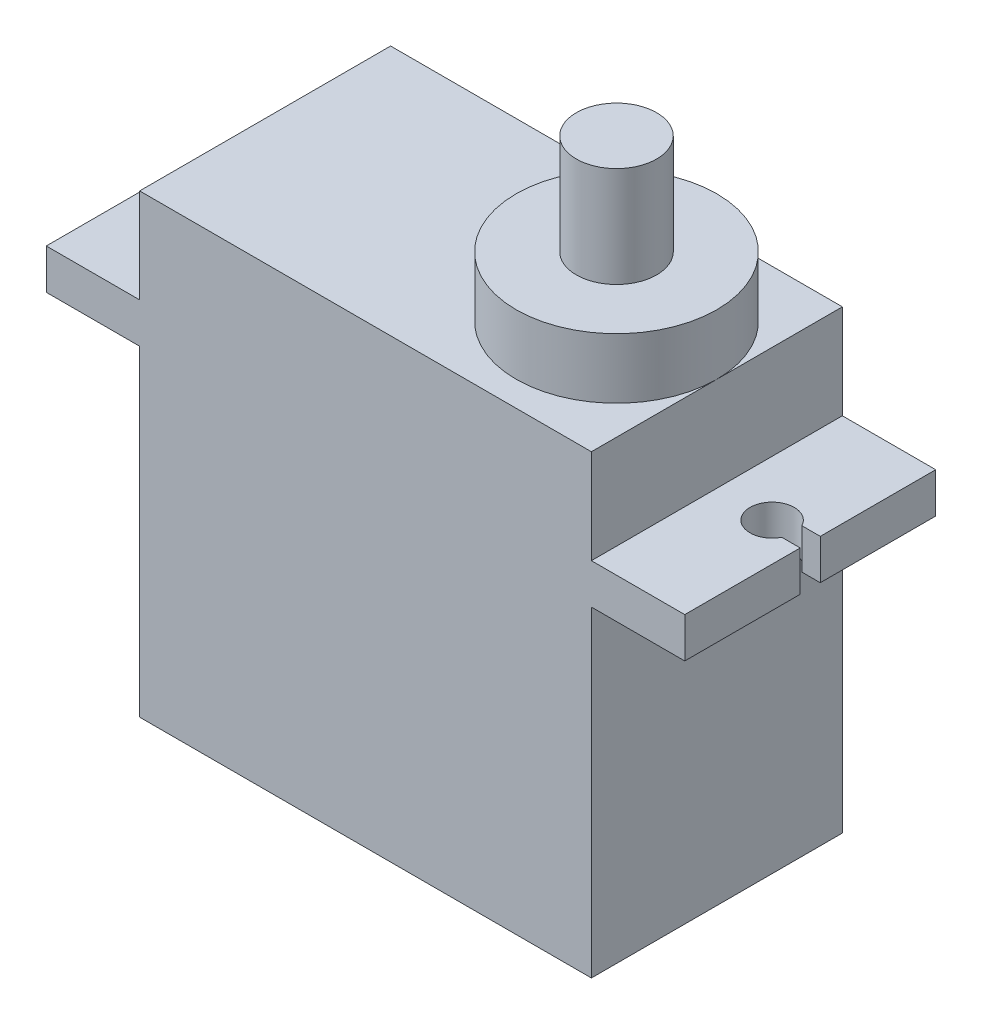
ISO-10303-21;
HEADER;
FILE_DESCRIPTION(('STEP AP214'),'2;1');
FILE_NAME('part.step','',(''),(''),'','','');
FILE_SCHEMA(('AUTOMOTIVE_DESIGN { 1 0 10303 214 1 1 1 1 }'));
ENDSEC;
DATA;
#1=APPLICATION_CONTEXT('core data for automotive mechanical design processes');
#2=APPLICATION_PROTOCOL_DEFINITION('international standard','automotive_design',2000,#1);
#3=PRODUCT_CONTEXT('',#1,'mechanical');
#4=PRODUCT('Part','Part','',(#3));
#5=PRODUCT_RELATED_PRODUCT_CATEGORY('part','',(#4));
#6=PRODUCT_DEFINITION_FORMATION('','',#4);
#7=PRODUCT_DEFINITION_CONTEXT('part definition',#1,'design');
#8=PRODUCT_DEFINITION('design','',#6,#7);
#9=PRODUCT_DEFINITION_SHAPE('','',#8);
#10=(LENGTH_UNIT() NAMED_UNIT(*) SI_UNIT(.MILLI.,.METRE.));
#11=(NAMED_UNIT(*) PLANE_ANGLE_UNIT() SI_UNIT($,.RADIAN.));
#12=(NAMED_UNIT(*) SI_UNIT($,.STERADIAN.) SOLID_ANGLE_UNIT());
#13=UNCERTAINTY_MEASURE_WITH_UNIT(LENGTH_MEASURE(1.E-05),#10,'distance_accuracy_value','');
#14=(GEOMETRIC_REPRESENTATION_CONTEXT(3) GLOBAL_UNCERTAINTY_ASSIGNED_CONTEXT((#13)) GLOBAL_UNIT_ASSIGNED_CONTEXT((#10,
#11,#12)) REPRESENTATION_CONTEXT('',''));
#15=CARTESIAN_POINT('',(0.,0.,0.));
#16=DIRECTION('',(0.,0.,1.));
#17=DIRECTION('',(1.,0.,0.));
#18=AXIS2_PLACEMENT_3D('',#15,#16,#17);
#19=CARTESIAN_POINT('',(-14.,18.,0.));
#20=DIRECTION('',(0.,1.,0.));
#21=DIRECTION('',(0.,0.,1.));
#22=AXIS2_PLACEMENT_3D('',#19,#20,#21);
#23=PLANE('',#22);
#24=DIRECTION('',(0.,0.,-1.));
#25=VECTOR('',#24,1.);
#26=CARTESIAN_POINT('',(11.25,18.,6.25));
#27=LINE('',#26,#25);
#28=CARTESIAN_POINT('',(11.25,18.,6.25));
#29=VERTEX_POINT('',#28);
#30=CARTESIAN_POINT('',(11.25,18.,-6.25));
#31=VERTEX_POINT('',#30);
#32=EDGE_CURVE('E52',#29,#31,#27,.T.);
#33=ORIENTED_EDGE('',*,*,#32,.F.);
#34=DIRECTION('',(1.,0.,0.));
#35=VECTOR('',#34,1.);
#36=CARTESIAN_POINT('',(-15.9,18.,6.25));
#37=LINE('',#36,#35);
#38=CARTESIAN_POINT('',(15.9,18.,6.25));
#39=VERTEX_POINT('',#38);
#40=EDGE_CURVE('E238',#29,#39,#37,.T.);
#41=ORIENTED_EDGE('',*,*,#40,.T.);
#42=DIRECTION('',(0.,0.,-1.));
#43=VECTOR('',#42,1.);
#44=CARTESIAN_POINT('',(15.9,18.,0.500000000000001));
#45=LINE('',#44,#43);
#46=CARTESIAN_POINT('',(15.9,18.,0.500000000000001));
#47=VERTEX_POINT('',#46);
#48=EDGE_CURVE('E213',#39,#47,#45,.T.);
#49=ORIENTED_EDGE('',*,*,#48,.T.);
#50=DIRECTION('',(-1.,0.,0.));
#51=VECTOR('',#50,1.);
#52=CARTESIAN_POINT('',(15.9,18.,0.500000000000001));
#53=LINE('',#52,#51);
#54=CARTESIAN_POINT('',(14.9797958971133,18.,0.5));
#55=VERTEX_POINT('',#54);
#56=EDGE_CURVE('E216',#47,#55,#53,.T.);
#57=ORIENTED_EDGE('',*,*,#56,.T.);
#58=CARTESIAN_POINT('',(14.,18.,0.));
#59=DIRECTION('',(0.,-1.,0.));
#60=DIRECTION('',(0.,0.,-1.));
#61=AXIS2_PLACEMENT_3D('',#58,#59,#60);
#62=CIRCLE('',#61,1.1);
#63=CARTESIAN_POINT('',(14.9797958971133,18.,-0.5));
#64=VERTEX_POINT('',#63);
#65=EDGE_CURVE('E219',#55,#64,#62,.T.);
#66=ORIENTED_EDGE('',*,*,#65,.T.);
#67=DIRECTION('',(1.,0.,0.));
#68=VECTOR('',#67,1.);
#69=CARTESIAN_POINT('',(15.9,18.,-0.5));
#70=LINE('',#69,#68);
#71=CARTESIAN_POINT('',(15.9,18.,-0.5));
#72=VERTEX_POINT('',#71);
#73=EDGE_CURVE('E221',#64,#72,#70,.T.);
#74=ORIENTED_EDGE('',*,*,#73,.T.);
#75=DIRECTION('',(0.,0.,-1.));
#76=VECTOR('',#75,1.);
#77=CARTESIAN_POINT('',(15.9,18.,-6.25));
#78=LINE('',#77,#76);
#79=CARTESIAN_POINT('',(15.9,18.,-6.25));
#80=VERTEX_POINT('',#79);
#81=EDGE_CURVE('E223',#72,#80,#78,.T.);
#82=ORIENTED_EDGE('',*,*,#81,.T.);
#83=DIRECTION('',(-1.,0.,0.));
#84=VECTOR('',#83,1.);
#85=CARTESIAN_POINT('',(-15.9,18.,-6.25));
#86=LINE('',#85,#84);
#87=EDGE_CURVE('E226',#80,#31,#86,.T.);
#88=ORIENTED_EDGE('',*,*,#87,.T.);
#89=EDGE_LOOP('',(#33,#41,#49,#57,#66,#74,#82,#88));
#90=FACE_BOUND('',#89,.T.);
#91=ADVANCED_FACE('F36',(#90),#23,.T.);
#92=CARTESIAN_POINT('',(11.25,16.,-6.25));
#93=DIRECTION('',(-1.,0.,0.));
#94=DIRECTION('',(0.,0.,1.));
#95=AXIS2_PLACEMENT_3D('',#92,#93,#94);
#96=PLANE('',#95);
#97=DIRECTION('',(0.,0.,-1.));
#98=VECTOR('',#97,1.);
#99=CARTESIAN_POINT('',(11.25,0.,-6.25));
#100=LINE('',#99,#98);
#101=CARTESIAN_POINT('',(11.25,0.,6.25));
#102=VERTEX_POINT('',#101);
#103=CARTESIAN_POINT('',(11.25,0.,-6.25));
#104=VERTEX_POINT('',#103);
#105=EDGE_CURVE('E304',#102,#104,#100,.T.);
#106=ORIENTED_EDGE('',*,*,#105,.T.);
#107=DIRECTION('',(0.,-1.,0.));
#108=VECTOR('',#107,1.);
#109=CARTESIAN_POINT('',(11.25,16.,-6.25));
#110=LINE('',#109,#108);
#111=CARTESIAN_POINT('',(11.25,16.,-6.25));
#112=VERTEX_POINT('',#111);
#113=EDGE_CURVE('E40',#112,#104,#110,.T.);
#114=ORIENTED_EDGE('',*,*,#113,.F.);
#115=DIRECTION('',(0.,0.,-1.));
#116=VECTOR('',#115,1.);
#117=CARTESIAN_POINT('',(11.25,16.,-6.25));
#118=LINE('',#117,#116);
#119=CARTESIAN_POINT('',(11.25,16.,6.25));
#120=VERTEX_POINT('',#119);
#121=EDGE_CURVE('E305',#120,#112,#118,.T.);
#122=ORIENTED_EDGE('',*,*,#121,.F.);
#123=DIRECTION('',(0.,-1.,0.));
#124=VECTOR('',#123,1.);
#125=CARTESIAN_POINT('',(11.25,16.,6.25));
#126=LINE('',#125,#124);
#127=EDGE_CURVE('E312',#120,#102,#126,.T.);
#128=ORIENTED_EDGE('',*,*,#127,.T.);
#129=EDGE_LOOP('',(#106,#114,#122,#128));
#130=FACE_BOUND('',#129,.T.);
#131=ADVANCED_FACE('F38',(#130),#96,.F.);
#132=CARTESIAN_POINT('',(-11.25,16.,-6.25));
#133=DIRECTION('',(0.,0.,1.));
#134=DIRECTION('',(1.,0.,0.));
#135=AXIS2_PLACEMENT_3D('',#132,#133,#134);
#136=PLANE('',#135);
#137=DIRECTION('',(-1.,0.,0.));
#138=VECTOR('',#137,1.);
#139=CARTESIAN_POINT('',(-11.25,0.,-6.25));
#140=LINE('',#139,#138);
#141=CARTESIAN_POINT('',(-11.25,0.,-6.25));
#142=VERTEX_POINT('',#141);
#143=EDGE_CURVE('E315',#104,#142,#140,.T.);
#144=ORIENTED_EDGE('',*,*,#143,.T.);
#145=DIRECTION('',(0.,-1.,0.));
#146=VECTOR('',#145,1.);
#147=CARTESIAN_POINT('',(-11.25,16.,-6.25));
#148=LINE('',#147,#146);
#149=CARTESIAN_POINT('',(-11.25,16.,-6.25));
#150=VERTEX_POINT('',#149);
#151=EDGE_CURVE('E324',#150,#142,#148,.T.);
#152=ORIENTED_EDGE('',*,*,#151,.F.);
#153=DIRECTION('',(-1.,0.,0.));
#154=VECTOR('',#153,1.);
#155=CARTESIAN_POINT('',(-15.9,16.,-6.25));
#156=LINE('',#155,#154);
#157=CARTESIAN_POINT('',(-15.9,16.,-6.25));
#158=VERTEX_POINT('',#157);
#159=EDGE_CURVE('E252',#150,#158,#156,.T.);
#160=ORIENTED_EDGE('',*,*,#159,.T.);
#161=DIRECTION('',(0.,-1.,0.));
#162=VECTOR('',#161,1.);
#163=CARTESIAN_POINT('',(-15.9,18.,-6.25));
#164=LINE('',#163,#162);
#165=CARTESIAN_POINT('',(-15.9,18.,-6.25));
#166=VERTEX_POINT('',#165);
#167=EDGE_CURVE('E286',#166,#158,#164,.T.);
#168=ORIENTED_EDGE('',*,*,#167,.F.);
#169=CARTESIAN_POINT('',(-11.25,18.,-6.25));
#170=VERTEX_POINT('',#169);
#171=EDGE_CURVE('E225',#170,#166,#86,.T.);
#172=ORIENTED_EDGE('',*,*,#171,.F.);
#173=DIRECTION('',(0.,-1.,0.));
#174=VECTOR('',#173,1.);
#175=CARTESIAN_POINT('',(-11.25,22.7,-6.25));
#176=LINE('',#175,#174);
#177=CARTESIAN_POINT('',(-11.25,22.7,-6.25));
#178=VERTEX_POINT('',#177);
#179=EDGE_CURVE('E209',#178,#170,#176,.T.);
#180=ORIENTED_EDGE('',*,*,#179,.F.);
#181=DIRECTION('',(-1.,0.,0.));
#182=VECTOR('',#181,1.);
#183=CARTESIAN_POINT('',(11.25,22.7,-6.25));
#184=LINE('',#183,#182);
#185=CARTESIAN_POINT('',(11.25,22.7,-6.25));
#186=VERTEX_POINT('',#185);
#187=EDGE_CURVE('E202',#186,#178,#184,.T.);
#188=ORIENTED_EDGE('',*,*,#187,.F.);
#189=DIRECTION('',(0.,-1.,0.));
#190=VECTOR('',#189,1.);
#191=CARTESIAN_POINT('',(11.25,22.7,-6.25));
#192=LINE('',#191,#190);
#193=EDGE_CURVE('E187',#186,#31,#192,.T.);
#194=ORIENTED_EDGE('',*,*,#193,.T.);
#195=ORIENTED_EDGE('',*,*,#87,.F.);
#196=DIRECTION('',(0.,-1.,0.));
#197=VECTOR('',#196,1.);
#198=CARTESIAN_POINT('',(15.9,18.,-6.25));
#199=LINE('',#198,#197);
#200=CARTESIAN_POINT('',(15.9,16.,-6.25));
#201=VERTEX_POINT('',#200);
#202=EDGE_CURVE('E289',#80,#201,#199,.T.);
#203=ORIENTED_EDGE('',*,*,#202,.T.);
#204=EDGE_CURVE('E253',#201,#112,#156,.T.);
#205=ORIENTED_EDGE('',*,*,#204,.T.);
#206=ORIENTED_EDGE('',*,*,#113,.T.);
#207=EDGE_LOOP('',(#144,#152,#160,#168,#172,#180,#188,#194,#195,#203,#205,#206));
#208=FACE_BOUND('',#207,.T.);
#209=ADVANCED_FACE('F331',(#208),#136,.F.);
#210=CARTESIAN_POINT('',(-11.25,16.,-6.25));
#211=DIRECTION('',(1.,0.,0.));
#212=DIRECTION('',(0.,0.,-1.));
#213=AXIS2_PLACEMENT_3D('',#210,#211,#212);
#214=PLANE('',#213);
#215=DIRECTION('',(0.,0.,1.));
#216=VECTOR('',#215,1.);
#217=CARTESIAN_POINT('',(-11.25,0.,-6.25));
#218=LINE('',#217,#216);
#219=CARTESIAN_POINT('',(-11.25,0.,6.25));
#220=VERTEX_POINT('',#219);
#221=EDGE_CURVE('E317',#142,#220,#218,.T.);
#222=ORIENTED_EDGE('',*,*,#221,.T.);
#223=DIRECTION('',(0.,-1.,0.));
#224=VECTOR('',#223,1.);
#225=CARTESIAN_POINT('',(-11.25,16.,6.25));
#226=LINE('',#225,#224);
#227=CARTESIAN_POINT('',(-11.25,16.,6.25));
#228=VERTEX_POINT('',#227);
#229=EDGE_CURVE('E322',#228,#220,#226,.T.);
#230=ORIENTED_EDGE('',*,*,#229,.F.);
#231=DIRECTION('',(0.,0.,1.));
#232=VECTOR('',#231,1.);
#233=CARTESIAN_POINT('',(-11.25,16.,-6.25));
#234=LINE('',#233,#232);
#235=EDGE_CURVE('E308',#150,#228,#234,.T.);
#236=ORIENTED_EDGE('',*,*,#235,.F.);
#237=ORIENTED_EDGE('',*,*,#151,.T.);
#238=EDGE_LOOP('',(#222,#230,#236,#237));
#239=FACE_BOUND('',#238,.T.);
#240=ADVANCED_FACE('F339',(#239),#214,.F.);
#241=CARTESIAN_POINT('',(-11.25,16.,6.25));
#242=DIRECTION('',(0.,0.,-1.));
#243=DIRECTION('',(-1.,0.,0.));
#244=AXIS2_PLACEMENT_3D('',#241,#242,#243);
#245=PLANE('',#244);
#246=DIRECTION('',(1.,0.,0.));
#247=VECTOR('',#246,1.);
#248=CARTESIAN_POINT('',(-11.25,0.,6.25));
#249=LINE('',#248,#247);
#250=EDGE_CURVE('E309',#220,#102,#249,.T.);
#251=ORIENTED_EDGE('',*,*,#250,.T.);
#252=ORIENTED_EDGE('',*,*,#127,.F.);
#253=DIRECTION('',(1.,0.,0.));
#254=VECTOR('',#253,1.);
#255=CARTESIAN_POINT('',(-15.9,16.,6.25));
#256=LINE('',#255,#254);
#257=CARTESIAN_POINT('',(15.9,16.,6.25));
#258=VERTEX_POINT('',#257);
#259=EDGE_CURVE('E266',#120,#258,#256,.T.);
#260=ORIENTED_EDGE('',*,*,#259,.T.);
#261=DIRECTION('',(0.,-1.,0.));
#262=VECTOR('',#261,1.);
#263=CARTESIAN_POINT('',(15.9,18.,6.25));
#264=LINE('',#263,#262);
#265=EDGE_CURVE('E241',#39,#258,#264,.T.);
#266=ORIENTED_EDGE('',*,*,#265,.F.);
#267=ORIENTED_EDGE('',*,*,#40,.F.);
#268=DIRECTION('',(0.,-1.,0.));
#269=VECTOR('',#268,1.);
#270=CARTESIAN_POINT('',(11.25,22.7,6.25));
#271=LINE('',#270,#269);
#272=CARTESIAN_POINT('',(11.25,22.7,6.25));
#273=VERTEX_POINT('',#272);
#274=EDGE_CURVE('E204',#273,#29,#271,.T.);
#275=ORIENTED_EDGE('',*,*,#274,.F.);
#276=DIRECTION('',(1.,0.,0.));
#277=VECTOR('',#276,1.);
#278=CARTESIAN_POINT('',(-11.25,22.7,6.25));
#279=LINE('',#278,#277);
#280=CARTESIAN_POINT('',(-11.25,22.7,6.25));
#281=VERTEX_POINT('',#280);
#282=EDGE_CURVE('E183',#281,#273,#279,.T.);
#283=ORIENTED_EDGE('',*,*,#282,.F.);
#284=DIRECTION('',(0.,-1.,0.));
#285=VECTOR('',#284,1.);
#286=CARTESIAN_POINT('',(-11.25,22.7,6.25));
#287=LINE('',#286,#285);
#288=CARTESIAN_POINT('',(-11.25,18.,6.25));
#289=VERTEX_POINT('',#288);
#290=EDGE_CURVE('E206',#281,#289,#287,.T.);
#291=ORIENTED_EDGE('',*,*,#290,.T.);
#292=CARTESIAN_POINT('',(-15.9,18.,6.25));
#293=VERTEX_POINT('',#292);
#294=EDGE_CURVE('E239',#293,#289,#37,.T.);
#295=ORIENTED_EDGE('',*,*,#294,.F.);
#296=DIRECTION('',(0.,-1.,0.));
#297=VECTOR('',#296,1.);
#298=CARTESIAN_POINT('',(-15.9,18.,6.25));
#299=LINE('',#298,#297);
#300=CARTESIAN_POINT('',(-15.9,16.,6.25));
#301=VERTEX_POINT('',#300);
#302=EDGE_CURVE('E271',#293,#301,#299,.T.);
#303=ORIENTED_EDGE('',*,*,#302,.T.);
#304=EDGE_CURVE('E217',#301,#228,#256,.T.);
#305=ORIENTED_EDGE('',*,*,#304,.T.);
#306=ORIENTED_EDGE('',*,*,#229,.T.);
#307=EDGE_LOOP('',(#251,#252,#260,#266,#267,#275,#283,#291,#295,#303,#305,#306));
#308=FACE_BOUND('',#307,.T.);
#309=ADVANCED_FACE('F341',(#308),#245,.F.);
#310=CARTESIAN_POINT('',(0.,0.,0.));
#311=DIRECTION('',(0.,1.,0.));
#312=DIRECTION('',(0.,0.,1.));
#313=AXIS2_PLACEMENT_3D('',#310,#311,#312);
#314=PLANE('',#313);
#315=ORIENTED_EDGE('',*,*,#105,.F.);
#316=ORIENTED_EDGE('',*,*,#250,.F.);
#317=ORIENTED_EDGE('',*,*,#221,.F.);
#318=ORIENTED_EDGE('',*,*,#143,.F.);
#319=EDGE_LOOP('',(#315,#316,#317,#318));
#320=FACE_BOUND('',#319,.T.);
#321=ADVANCED_FACE('F338',(#320),#314,.F.);
#322=CARTESIAN_POINT('',(-14.,16.,0.));
#323=DIRECTION('',(0.,1.,0.));
#324=DIRECTION('',(0.,0.,1.));
#325=AXIS2_PLACEMENT_3D('',#322,#323,#324);
#326=PLANE('',#325);
#327=ORIENTED_EDGE('',*,*,#259,.F.);
#328=ORIENTED_EDGE('',*,*,#121,.T.);
#329=ORIENTED_EDGE('',*,*,#204,.F.);
#330=DIRECTION('',(0.,0.,-1.));
#331=VECTOR('',#330,1.);
#332=CARTESIAN_POINT('',(15.9,16.,-6.25));
#333=LINE('',#332,#331);
#334=CARTESIAN_POINT('',(15.9,16.,-0.5));
#335=VERTEX_POINT('',#334);
#336=EDGE_CURVE('E250',#335,#201,#333,.T.);
#337=ORIENTED_EDGE('',*,*,#336,.F.);
#338=DIRECTION('',(1.,0.,0.));
#339=VECTOR('',#338,1.);
#340=CARTESIAN_POINT('',(15.9,16.,-0.5));
#341=LINE('',#340,#339);
#342=CARTESIAN_POINT('',(14.9797958971133,16.,-0.5));
#343=VERTEX_POINT('',#342);
#344=EDGE_CURVE('E248',#343,#335,#341,.T.);
#345=ORIENTED_EDGE('',*,*,#344,.F.);
#346=CARTESIAN_POINT('',(14.,16.,0.));
#347=DIRECTION('',(0.,-1.,0.));
#348=DIRECTION('',(0.,0.,-1.));
#349=AXIS2_PLACEMENT_3D('',#346,#347,#348);
#350=CIRCLE('',#349,1.1);
#351=CARTESIAN_POINT('',(14.9797958971133,16.,0.5));
#352=VERTEX_POINT('',#351);
#353=EDGE_CURVE('E246',#352,#343,#350,.T.);
#354=ORIENTED_EDGE('',*,*,#353,.F.);
#355=DIRECTION('',(-1.,0.,0.));
#356=VECTOR('',#355,1.);
#357=CARTESIAN_POINT('',(15.9,16.,0.500000000000001));
#358=LINE('',#357,#356);
#359=CARTESIAN_POINT('',(15.9,16.,0.500000000000001));
#360=VERTEX_POINT('',#359);
#361=EDGE_CURVE('E244',#360,#352,#358,.T.);
#362=ORIENTED_EDGE('',*,*,#361,.F.);
#363=DIRECTION('',(0.,0.,-1.));
#364=VECTOR('',#363,1.);
#365=CARTESIAN_POINT('',(15.9,16.,0.500000000000001));
#366=LINE('',#365,#364);
#367=EDGE_CURVE('E212',#258,#360,#366,.T.);
#368=ORIENTED_EDGE('',*,*,#367,.F.);
#369=EDGE_LOOP('',(#327,#328,#329,#337,#345,#354,#362,#368));
#370=FACE_BOUND('',#369,.T.);
#371=ADVANCED_FACE('F417',(#370),#326,.F.);
#372=ORIENTED_EDGE('',*,*,#159,.F.);
#373=ORIENTED_EDGE('',*,*,#235,.T.);
#374=ORIENTED_EDGE('',*,*,#304,.F.);
#375=DIRECTION('',(0.,0.,1.));
#376=VECTOR('',#375,1.);
#377=CARTESIAN_POINT('',(-15.9,16.,0.500000000000001));
#378=LINE('',#377,#376);
#379=CARTESIAN_POINT('',(-15.9,16.,0.500000000000001));
#380=VERTEX_POINT('',#379);
#381=EDGE_CURVE('E264',#380,#301,#378,.T.);
#382=ORIENTED_EDGE('',*,*,#381,.F.);
#383=DIRECTION('',(-1.,0.,0.));
#384=VECTOR('',#383,1.);
#385=CARTESIAN_POINT('',(-15.9,16.,0.500000000000001));
#386=LINE('',#385,#384);
#387=CARTESIAN_POINT('',(-14.9797958971133,16.,0.5));
#388=VERTEX_POINT('',#387);
#389=EDGE_CURVE('E262',#388,#380,#386,.T.);
#390=ORIENTED_EDGE('',*,*,#389,.F.);
#391=CARTESIAN_POINT('',(-14.,16.,0.));
#392=DIRECTION('',(0.,-1.,0.));
#393=DIRECTION('',(0.,0.,1.));
#394=AXIS2_PLACEMENT_3D('',#391,#392,#393);
#395=CIRCLE('',#394,1.1);
#396=CARTESIAN_POINT('',(-14.9797958971133,16.,-0.5));
#397=VERTEX_POINT('',#396);
#398=EDGE_CURVE('E260',#397,#388,#395,.T.);
#399=ORIENTED_EDGE('',*,*,#398,.F.);
#400=DIRECTION('',(1.,0.,0.));
#401=VECTOR('',#400,1.);
#402=CARTESIAN_POINT('',(-15.9,16.,-0.5));
#403=LINE('',#402,#401);
#404=CARTESIAN_POINT('',(-15.9,16.,-0.5));
#405=VERTEX_POINT('',#404);
#406=EDGE_CURVE('E258',#405,#397,#403,.T.);
#407=ORIENTED_EDGE('',*,*,#406,.F.);
#408=DIRECTION('',(0.,0.,1.));
#409=VECTOR('',#408,1.);
#410=CARTESIAN_POINT('',(-15.9,16.,-6.25));
#411=LINE('',#410,#409);
#412=EDGE_CURVE('E256',#158,#405,#411,.T.);
#413=ORIENTED_EDGE('',*,*,#412,.F.);
#414=EDGE_LOOP('',(#372,#373,#374,#382,#390,#399,#407,#413));
#415=FACE_BOUND('',#414,.T.);
#416=ADVANCED_FACE('F348',(#415),#326,.F.);
#417=CARTESIAN_POINT('',(15.9,18.,0.500000000000001));
#418=DIRECTION('',(-1.,0.,0.));
#419=DIRECTION('',(0.,0.,1.));
#420=AXIS2_PLACEMENT_3D('',#417,#418,#419);
#421=PLANE('',#420);
#422=ORIENTED_EDGE('',*,*,#367,.T.);
#423=DIRECTION('',(0.,-1.,0.));
#424=VECTOR('',#423,1.);
#425=CARTESIAN_POINT('',(15.9,18.,0.500000000000001));
#426=LINE('',#425,#424);
#427=EDGE_CURVE('E301',#47,#360,#426,.T.);
#428=ORIENTED_EDGE('',*,*,#427,.F.);
#429=ORIENTED_EDGE('',*,*,#48,.F.);
#430=ORIENTED_EDGE('',*,*,#265,.T.);
#431=EDGE_LOOP('',(#422,#428,#429,#430));
#432=FACE_BOUND('',#431,.T.);
#433=ADVANCED_FACE('F443',(#432),#421,.F.);
#434=CARTESIAN_POINT('',(15.9,18.,0.500000000000001));
#435=DIRECTION('',(0.,0.,1.));
#436=DIRECTION('',(1.,0.,0.));
#437=AXIS2_PLACEMENT_3D('',#434,#435,#436);
#438=PLANE('',#437);
#439=ORIENTED_EDGE('',*,*,#361,.T.);
#440=DIRECTION('',(0.,-1.,0.));
#441=VECTOR('',#440,1.);
#442=CARTESIAN_POINT('',(14.9797958971133,18.,0.5));
#443=LINE('',#442,#441);
#444=EDGE_CURVE('E298',#55,#352,#443,.T.);
#445=ORIENTED_EDGE('',*,*,#444,.F.);
#446=ORIENTED_EDGE('',*,*,#56,.F.);
#447=ORIENTED_EDGE('',*,*,#427,.T.);
#448=EDGE_LOOP('',(#439,#445,#446,#447));
#449=FACE_BOUND('',#448,.T.);
#450=ADVANCED_FACE('F439',(#449),#438,.F.);
#451=CARTESIAN_POINT('',(14.,18.,0.));
#452=DIRECTION('',(0.,-1.,0.));
#453=DIRECTION('',(0.,0.,-1.));
#454=AXIS2_PLACEMENT_3D('',#451,#452,#453);
#455=CYLINDRICAL_SURFACE('',#454,1.1);
#456=ORIENTED_EDGE('',*,*,#353,.T.);
#457=DIRECTION('',(0.,-1.,0.));
#458=VECTOR('',#457,1.);
#459=CARTESIAN_POINT('',(14.9797958971133,18.,-0.5));
#460=LINE('',#459,#458);
#461=EDGE_CURVE('E295',#64,#343,#460,.T.);
#462=ORIENTED_EDGE('',*,*,#461,.F.);
#463=ORIENTED_EDGE('',*,*,#65,.F.);
#464=ORIENTED_EDGE('',*,*,#444,.T.);
#465=EDGE_LOOP('',(#456,#462,#463,#464));
#466=FACE_BOUND('',#465,.T.);
#467=ADVANCED_FACE('F435',(#466),#455,.F.);
#468=CARTESIAN_POINT('',(15.9,18.,-0.5));
#469=DIRECTION('',(0.,0.,-1.));
#470=DIRECTION('',(-1.,0.,0.));
#471=AXIS2_PLACEMENT_3D('',#468,#469,#470);
#472=PLANE('',#471);
#473=ORIENTED_EDGE('',*,*,#344,.T.);
#474=DIRECTION('',(0.,-1.,0.));
#475=VECTOR('',#474,1.);
#476=CARTESIAN_POINT('',(15.9,18.,-0.5));
#477=LINE('',#476,#475);
#478=EDGE_CURVE('E292',#72,#335,#477,.T.);
#479=ORIENTED_EDGE('',*,*,#478,.F.);
#480=ORIENTED_EDGE('',*,*,#73,.F.);
#481=ORIENTED_EDGE('',*,*,#461,.T.);
#482=EDGE_LOOP('',(#473,#479,#480,#481));
#483=FACE_BOUND('',#482,.T.);
#484=ADVANCED_FACE('F431',(#483),#472,.F.);
#485=CARTESIAN_POINT('',(15.9,18.,-6.25));
#486=DIRECTION('',(-1.,0.,0.));
#487=DIRECTION('',(0.,0.,1.));
#488=AXIS2_PLACEMENT_3D('',#485,#486,#487);
#489=PLANE('',#488);
#490=ORIENTED_EDGE('',*,*,#336,.T.);
#491=ORIENTED_EDGE('',*,*,#202,.F.);
#492=ORIENTED_EDGE('',*,*,#81,.F.);
#493=ORIENTED_EDGE('',*,*,#478,.T.);
#494=EDGE_LOOP('',(#490,#491,#492,#493));
#495=FACE_BOUND('',#494,.T.);
#496=ADVANCED_FACE('F428',(#495),#489,.F.);
#497=CARTESIAN_POINT('',(-15.9,18.,-6.25));
#498=DIRECTION('',(1.,0.,0.));
#499=DIRECTION('',(0.,0.,-1.));
#500=AXIS2_PLACEMENT_3D('',#497,#498,#499);
#501=PLANE('',#500);
#502=ORIENTED_EDGE('',*,*,#412,.T.);
#503=DIRECTION('',(0.,-1.,0.));
#504=VECTOR('',#503,1.);
#505=CARTESIAN_POINT('',(-15.9,18.,-0.5));
#506=LINE('',#505,#504);
#507=CARTESIAN_POINT('',(-15.9,18.,-0.5));
#508=VERTEX_POINT('',#507);
#509=EDGE_CURVE('E283',#508,#405,#506,.T.);
#510=ORIENTED_EDGE('',*,*,#509,.F.);
#511=DIRECTION('',(0.,0.,1.));
#512=VECTOR('',#511,1.);
#513=CARTESIAN_POINT('',(-15.9,18.,-6.25));
#514=LINE('',#513,#512);
#515=EDGE_CURVE('E228',#166,#508,#514,.T.);
#516=ORIENTED_EDGE('',*,*,#515,.F.);
#517=ORIENTED_EDGE('',*,*,#167,.T.);
#518=EDGE_LOOP('',(#502,#510,#516,#517));
#519=FACE_BOUND('',#518,.T.);
#520=ADVANCED_FACE('F355',(#519),#501,.F.);
#521=CARTESIAN_POINT('',(-15.9,18.,-0.5));
#522=DIRECTION('',(0.,0.,-1.));
#523=DIRECTION('',(-1.,0.,0.));
#524=AXIS2_PLACEMENT_3D('',#521,#522,#523);
#525=PLANE('',#524);
#526=ORIENTED_EDGE('',*,*,#406,.T.);
#527=DIRECTION('',(0.,-1.,0.));
#528=VECTOR('',#527,1.);
#529=CARTESIAN_POINT('',(-14.9797958971133,18.,-0.5));
#530=LINE('',#529,#528);
#531=CARTESIAN_POINT('',(-14.9797958971133,18.,-0.5));
#532=VERTEX_POINT('',#531);
#533=EDGE_CURVE('E280',#532,#397,#530,.T.);
#534=ORIENTED_EDGE('',*,*,#533,.F.);
#535=DIRECTION('',(1.,0.,0.));
#536=VECTOR('',#535,1.);
#537=CARTESIAN_POINT('',(-15.9,18.,-0.5));
#538=LINE('',#537,#536);
#539=EDGE_CURVE('E230',#508,#532,#538,.T.);
#540=ORIENTED_EDGE('',*,*,#539,.F.);
#541=ORIENTED_EDGE('',*,*,#509,.T.);
#542=EDGE_LOOP('',(#526,#534,#540,#541));
#543=FACE_BOUND('',#542,.T.);
#544=ADVANCED_FACE('F421',(#543),#525,.F.);
#545=CARTESIAN_POINT('',(-14.,18.,0.));
#546=DIRECTION('',(0.,-1.,0.));
#547=DIRECTION('',(0.,0.,-1.));
#548=AXIS2_PLACEMENT_3D('',#545,#546,#547);
#549=CYLINDRICAL_SURFACE('',#548,1.1);
#550=ORIENTED_EDGE('',*,*,#398,.T.);
#551=DIRECTION('',(0.,-1.,0.));
#552=VECTOR('',#551,1.);
#553=CARTESIAN_POINT('',(-14.9797958971133,18.,0.5));
#554=LINE('',#553,#552);
#555=CARTESIAN_POINT('',(-14.9797958971133,18.,0.5));
#556=VERTEX_POINT('',#555);
#557=EDGE_CURVE('E277',#556,#388,#554,.T.);
#558=ORIENTED_EDGE('',*,*,#557,.F.);
#559=CARTESIAN_POINT('',(-14.,18.,0.));
#560=DIRECTION('',(0.,-1.,0.));
#561=DIRECTION('',(0.,0.,1.));
#562=AXIS2_PLACEMENT_3D('',#559,#560,#561);
#563=CIRCLE('',#562,1.1);
#564=EDGE_CURVE('E232',#532,#556,#563,.T.);
#565=ORIENTED_EDGE('',*,*,#564,.F.);
#566=ORIENTED_EDGE('',*,*,#533,.T.);
#567=EDGE_LOOP('',(#550,#558,#565,#566));
#568=FACE_BOUND('',#567,.T.);
#569=ADVANCED_FACE('F414',(#568),#549,.F.);
#570=CARTESIAN_POINT('',(-15.9,18.,0.500000000000001));
#571=DIRECTION('',(0.,0.,1.));
#572=DIRECTION('',(1.,0.,0.));
#573=AXIS2_PLACEMENT_3D('',#570,#571,#572);
#574=PLANE('',#573);
#575=ORIENTED_EDGE('',*,*,#389,.T.);
#576=DIRECTION('',(0.,-1.,0.));
#577=VECTOR('',#576,1.);
#578=CARTESIAN_POINT('',(-15.9,18.,0.500000000000001));
#579=LINE('',#578,#577);
#580=CARTESIAN_POINT('',(-15.9,18.,0.500000000000001));
#581=VERTEX_POINT('',#580);
#582=EDGE_CURVE('E274',#581,#380,#579,.T.);
#583=ORIENTED_EDGE('',*,*,#582,.F.);
#584=DIRECTION('',(-1.,0.,0.));
#585=VECTOR('',#584,1.);
#586=CARTESIAN_POINT('',(-15.9,18.,0.500000000000001));
#587=LINE('',#586,#585);
#588=EDGE_CURVE('E234',#556,#581,#587,.T.);
#589=ORIENTED_EDGE('',*,*,#588,.F.);
#590=ORIENTED_EDGE('',*,*,#557,.T.);
#591=EDGE_LOOP('',(#575,#583,#589,#590));
#592=FACE_BOUND('',#591,.T.);
#593=ADVANCED_FACE('F408',(#592),#574,.F.);
#594=CARTESIAN_POINT('',(-15.9,18.,0.500000000000001));
#595=DIRECTION('',(1.,0.,0.));
#596=DIRECTION('',(0.,0.,-1.));
#597=AXIS2_PLACEMENT_3D('',#594,#595,#596);
#598=PLANE('',#597);
#599=ORIENTED_EDGE('',*,*,#381,.T.);
#600=ORIENTED_EDGE('',*,*,#302,.F.);
#601=DIRECTION('',(0.,0.,1.));
#602=VECTOR('',#601,1.);
#603=CARTESIAN_POINT('',(-15.9,18.,0.500000000000001));
#604=LINE('',#603,#602);
#605=EDGE_CURVE('E236',#581,#293,#604,.T.);
#606=ORIENTED_EDGE('',*,*,#605,.F.);
#607=ORIENTED_EDGE('',*,*,#582,.T.);
#608=EDGE_LOOP('',(#599,#600,#606,#607));
#609=FACE_BOUND('',#608,.T.);
#610=ADVANCED_FACE('F403',(#609),#598,.F.);
#611=DIRECTION('',(0.,0.,1.));
#612=VECTOR('',#611,1.);
#613=CARTESIAN_POINT('',(-11.25,18.,-6.25));
#614=LINE('',#613,#612);
#615=EDGE_CURVE('E60',#170,#289,#614,.T.);
#616=ORIENTED_EDGE('',*,*,#615,.F.);
#617=ORIENTED_EDGE('',*,*,#171,.T.);
#618=ORIENTED_EDGE('',*,*,#515,.T.);
#619=ORIENTED_EDGE('',*,*,#539,.T.);
#620=ORIENTED_EDGE('',*,*,#564,.T.);
#621=ORIENTED_EDGE('',*,*,#588,.T.);
#622=ORIENTED_EDGE('',*,*,#605,.T.);
#623=ORIENTED_EDGE('',*,*,#294,.T.);
#624=EDGE_LOOP('',(#616,#617,#618,#619,#620,#621,#622,#623));
#625=FACE_BOUND('',#624,.T.);
#626=ADVANCED_FACE('F358',(#625),#23,.T.);
#627=CARTESIAN_POINT('',(-11.25,22.7,-6.25));
#628=DIRECTION('',(1.,0.,0.));
#629=DIRECTION('',(0.,0.,-1.));
#630=AXIS2_PLACEMENT_3D('',#627,#628,#629);
#631=PLANE('',#630);
#632=ORIENTED_EDGE('',*,*,#615,.T.);
#633=ORIENTED_EDGE('',*,*,#290,.F.);
#634=DIRECTION('',(0.,0.,1.));
#635=VECTOR('',#634,1.);
#636=CARTESIAN_POINT('',(-11.25,22.7,-6.25));
#637=LINE('',#636,#635);
#638=EDGE_CURVE('E195',#178,#281,#637,.T.);
#639=ORIENTED_EDGE('',*,*,#638,.F.);
#640=ORIENTED_EDGE('',*,*,#179,.T.);
#641=EDGE_LOOP('',(#632,#633,#639,#640));
#642=FACE_BOUND('',#641,.T.);
#643=ADVANCED_FACE('F362',(#642),#631,.F.);
#644=CARTESIAN_POINT('',(11.25,22.7,6.25));
#645=DIRECTION('',(-1.,0.,0.));
#646=DIRECTION('',(0.,0.,1.));
#647=AXIS2_PLACEMENT_3D('',#644,#645,#646);
#648=PLANE('',#647);
#649=ORIENTED_EDGE('',*,*,#32,.T.);
#650=ORIENTED_EDGE('',*,*,#193,.F.);
#651=DIRECTION('',(0.,0.,-1.));
#652=VECTOR('',#651,1.);
#653=CARTESIAN_POINT('',(11.25,22.7,6.25));
#654=LINE('',#653,#652);
#655=CARTESIAN_POINT('',(11.25,22.7,0.));
#656=VERTEX_POINT('',#655);
#657=EDGE_CURVE('E188',#656,#186,#654,.T.);
#658=ORIENTED_EDGE('',*,*,#657,.F.);
#659=EDGE_CURVE('E177',#273,#656,#654,.T.);
#660=ORIENTED_EDGE('',*,*,#659,.F.);
#661=ORIENTED_EDGE('',*,*,#274,.T.);
#662=EDGE_LOOP('',(#649,#650,#658,#660,#661));
#663=FACE_BOUND('',#662,.T.);
#664=ADVANCED_FACE('F191',(#663),#648,.F.);
#665=CARTESIAN_POINT('',(0.,22.7,0.));
#666=DIRECTION('',(0.,1.,0.));
#667=DIRECTION('',(0.,0.,1.));
#668=AXIS2_PLACEMENT_3D('',#665,#666,#667);
#669=PLANE('',#668);
#670=ORIENTED_EDGE('',*,*,#659,.T.);
#671=CARTESIAN_POINT('',(6.25,22.7,0.));
#672=DIRECTION('',(0.,1.,0.));
#673=DIRECTION('',(0.,0.,1.));
#674=AXIS2_PLACEMENT_3D('',#671,#672,#673);
#675=CIRCLE('',#674,5.);
#676=EDGE_CURVE('E181',#656,#656,#675,.T.);
#677=ORIENTED_EDGE('',*,*,#676,.F.);
#678=ORIENTED_EDGE('',*,*,#657,.T.);
#679=ORIENTED_EDGE('',*,*,#187,.T.);
#680=ORIENTED_EDGE('',*,*,#638,.T.);
#681=ORIENTED_EDGE('',*,*,#282,.T.);
#682=EDGE_LOOP('',(#670,#677,#678,#679,#680,#681));
#683=FACE_BOUND('',#682,.T.);
#684=ADVANCED_FACE('F179',(#683),#669,.T.);
#685=CARTESIAN_POINT('',(6.25,25.7,0.));
#686=DIRECTION('',(0.,-1.,0.));
#687=DIRECTION('',(0.,0.,-1.));
#688=AXIS2_PLACEMENT_3D('',#685,#686,#687);
#689=CYLINDRICAL_SURFACE('',#688,5.);
#690=CARTESIAN_POINT('',(6.25,25.7,0.));
#691=DIRECTION('',(0.,1.,0.));
#692=DIRECTION('',(0.,0.,1.));
#693=AXIS2_PLACEMENT_3D('',#690,#691,#692);
#694=CIRCLE('',#693,5.);
#695=CARTESIAN_POINT('',(6.25,25.7,5.));
#696=VERTEX_POINT('',#695);
#697=EDGE_CURVE('E200',#696,#696,#694,.T.);
#698=ORIENTED_EDGE('',*,*,#697,.F.);
#699=EDGE_LOOP('',(#698));
#700=FACE_BOUND('',#699,.T.);
#701=ORIENTED_EDGE('',*,*,#676,.T.);
#702=EDGE_LOOP('',(#701));
#703=FACE_BOUND('',#702,.T.);
#704=ADVANCED_FACE('F384',(#700,#703),#689,.T.);
#705=CARTESIAN_POINT('',(6.25,25.7,0.));
#706=DIRECTION('',(0.,1.,0.));
#707=DIRECTION('',(0.,0.,1.));
#708=AXIS2_PLACEMENT_3D('',#705,#706,#707);
#709=PLANE('',#708);
#710=CARTESIAN_POINT('',(6.25,25.7,0.));
#711=DIRECTION('',(0.,1.,0.));
#712=DIRECTION('',(0.,0.,1.));
#713=AXIS2_PLACEMENT_3D('',#710,#711,#712);
#714=CIRCLE('',#713,2.);
#715=CARTESIAN_POINT('',(6.25,25.7,2.));
#716=VERTEX_POINT('',#715);
#717=EDGE_CURVE('E11',#716,#716,#714,.T.);
#718=ORIENTED_EDGE('',*,*,#717,.F.);
#719=EDGE_LOOP('',(#718));
#720=FACE_BOUND('',#719,.T.);
#721=ORIENTED_EDGE('',*,*,#697,.T.);
#722=EDGE_LOOP('',(#721));
#723=FACE_BOUND('',#722,.T.);
#724=ADVANCED_FACE('F378',(#720,#723),#709,.T.);
#725=CARTESIAN_POINT('',(6.25,30.7,0.));
#726=DIRECTION('',(0.,-1.,0.));
#727=DIRECTION('',(0.,0.,-1.));
#728=AXIS2_PLACEMENT_3D('',#725,#726,#727);
#729=CYLINDRICAL_SURFACE('',#728,2.);
#730=CARTESIAN_POINT('',(6.25,30.7,0.));
#731=DIRECTION('',(0.,1.,0.));
#732=DIRECTION('',(0.,0.,1.));
#733=AXIS2_PLACEMENT_3D('',#730,#731,#732);
#734=CIRCLE('',#733,2.);
#735=CARTESIAN_POINT('',(6.25,30.7,2.));
#736=VERTEX_POINT('',#735);
#737=EDGE_CURVE('E367',#736,#736,#734,.T.);
#738=ORIENTED_EDGE('',*,*,#737,.F.);
#739=EDGE_LOOP('',(#738));
#740=FACE_BOUND('',#739,.T.);
#741=ORIENTED_EDGE('',*,*,#717,.T.);
#742=EDGE_LOOP('',(#741));
#743=FACE_BOUND('',#742,.T.);
#744=ADVANCED_FACE('F375',(#740,#743),#729,.T.);
#745=CARTESIAN_POINT('',(6.25,30.7,0.));
#746=DIRECTION('',(0.,1.,0.));
#747=DIRECTION('',(0.,0.,1.));
#748=AXIS2_PLACEMENT_3D('',#745,#746,#747);
#749=PLANE('',#748);
#750=ORIENTED_EDGE('',*,*,#737,.T.);
#751=EDGE_LOOP('',(#750));
#752=FACE_BOUND('',#751,.T.);
#753=ADVANCED_FACE('F373',(#752),#749,.T.);
#754=CLOSED_SHELL('',(#91,#131,#209,#240,#309,#321,#371,#416,#433,#450,#467,#484,#496,#520,#544,
#569,#593,#610,#626,#643,#664,#684,#704,#724,#744,#753));
#755=MANIFOLD_SOLID_BREP('B2',#754);
#756=ADVANCED_BREP_SHAPE_REPRESENTATION('',(#18,#755),#14);
#757=SHAPE_DEFINITION_REPRESENTATION(#9,#756);
ENDSEC;
END-ISO-10303-21;
